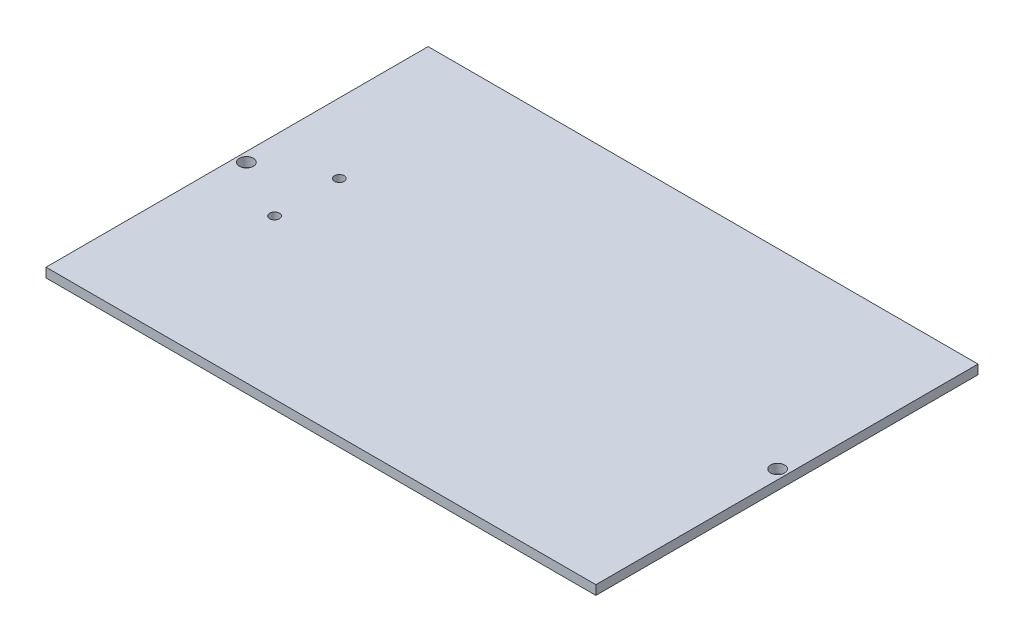
ISO-10303-21;
HEADER;
FILE_DESCRIPTION(('STEP AP214'),'2;1');
FILE_NAME('part.step','',(''),(''),'','','');
FILE_SCHEMA(('AUTOMOTIVE_DESIGN { 1 0 10303 214 1 1 1 1 }'));
ENDSEC;
DATA;
#1=APPLICATION_CONTEXT('core data for automotive mechanical design processes');
#2=APPLICATION_PROTOCOL_DEFINITION('international standard','automotive_design',2000,#1);
#3=PRODUCT_CONTEXT('',#1,'mechanical');
#4=PRODUCT('Part','Part','',(#3));
#5=PRODUCT_RELATED_PRODUCT_CATEGORY('part','',(#4));
#6=PRODUCT_DEFINITION_FORMATION('','',#4);
#7=PRODUCT_DEFINITION_CONTEXT('part definition',#1,'design');
#8=PRODUCT_DEFINITION('design','',#6,#7);
#9=PRODUCT_DEFINITION_SHAPE('','',#8);
#10=(LENGTH_UNIT() NAMED_UNIT(*) SI_UNIT(.MILLI.,.METRE.));
#11=(NAMED_UNIT(*) PLANE_ANGLE_UNIT() SI_UNIT($,.RADIAN.));
#12=(NAMED_UNIT(*) SI_UNIT($,.STERADIAN.) SOLID_ANGLE_UNIT());
#13=UNCERTAINTY_MEASURE_WITH_UNIT(LENGTH_MEASURE(1.E-05),#10,'distance_accuracy_value','');
#14=(GEOMETRIC_REPRESENTATION_CONTEXT(3) GLOBAL_UNCERTAINTY_ASSIGNED_CONTEXT((#13)) GLOBAL_UNIT_ASSIGNED_CONTEXT((#10,
#11,#12)) REPRESENTATION_CONTEXT('',''));
#15=CARTESIAN_POINT('',(0.,0.,0.));
#16=DIRECTION('',(0.,0.,1.));
#17=DIRECTION('',(1.,0.,0.));
#18=AXIS2_PLACEMENT_3D('',#15,#16,#17);
#19=CARTESIAN_POINT('',(59.,2.,41.));
#20=DIRECTION('',(-1.,0.,0.));
#21=DIRECTION('',(0.,0.,1.));
#22=AXIS2_PLACEMENT_3D('',#19,#20,#21);
#23=PLANE('',#22);
#24=DIRECTION('',(0.,0.,-1.));
#25=VECTOR('',#24,1.);
#26=CARTESIAN_POINT('',(59.,0.,41.));
#27=LINE('',#26,#25);
#28=CARTESIAN_POINT('',(59.,0.,41.));
#29=VERTEX_POINT('',#28);
#30=CARTESIAN_POINT('',(59.,0.,-41.));
#31=VERTEX_POINT('',#30);
#32=EDGE_CURVE('E109',#29,#31,#27,.T.);
#33=ORIENTED_EDGE('',*,*,#32,.T.);
#34=DIRECTION('',(0.,-1.,0.));
#35=VECTOR('',#34,1.);
#36=CARTESIAN_POINT('',(59.,2.,-41.));
#37=LINE('',#36,#35);
#38=CARTESIAN_POINT('',(59.,2.,-41.));
#39=VERTEX_POINT('',#38);
#40=EDGE_CURVE('E11',#39,#31,#37,.T.);
#41=ORIENTED_EDGE('',*,*,#40,.F.);
#42=DIRECTION('',(0.,0.,-1.));
#43=VECTOR('',#42,1.);
#44=CARTESIAN_POINT('',(59.,2.,41.));
#45=LINE('',#44,#43);
#46=CARTESIAN_POINT('',(59.,2.,41.));
#47=VERTEX_POINT('',#46);
#48=EDGE_CURVE('E92',#47,#39,#45,.T.);
#49=ORIENTED_EDGE('',*,*,#48,.F.);
#50=DIRECTION('',(0.,-1.,0.));
#51=VECTOR('',#50,1.);
#52=CARTESIAN_POINT('',(59.,2.,41.));
#53=LINE('',#52,#51);
#54=EDGE_CURVE('E105',#47,#29,#53,.T.);
#55=ORIENTED_EDGE('',*,*,#54,.T.);
#56=EDGE_LOOP('',(#33,#41,#49,#55));
#57=FACE_BOUND('',#56,.T.);
#58=ADVANCED_FACE('F38',(#57),#23,.F.);
#59=CARTESIAN_POINT('',(-59.,2.,-41.));
#60=DIRECTION('',(0.,0.,1.));
#61=DIRECTION('',(1.,0.,0.));
#62=AXIS2_PLACEMENT_3D('',#59,#60,#61);
#63=PLANE('',#62);
#64=DIRECTION('',(-1.,0.,0.));
#65=VECTOR('',#64,1.);
#66=CARTESIAN_POINT('',(-59.,0.,-41.));
#67=LINE('',#66,#65);
#68=CARTESIAN_POINT('',(-59.,0.,-41.));
#69=VERTEX_POINT('',#68);
#70=EDGE_CURVE('E97',#31,#69,#67,.T.);
#71=ORIENTED_EDGE('',*,*,#70,.T.);
#72=DIRECTION('',(0.,-1.,0.));
#73=VECTOR('',#72,1.);
#74=CARTESIAN_POINT('',(-59.,2.,-41.));
#75=LINE('',#74,#73);
#76=CARTESIAN_POINT('',(-59.,2.,-41.));
#77=VERTEX_POINT('',#76);
#78=EDGE_CURVE('E48',#77,#69,#75,.T.);
#79=ORIENTED_EDGE('',*,*,#78,.F.);
#80=DIRECTION('',(-1.,0.,0.));
#81=VECTOR('',#80,1.);
#82=CARTESIAN_POINT('',(-59.,2.,-41.));
#83=LINE('',#82,#81);
#84=EDGE_CURVE('E87',#39,#77,#83,.T.);
#85=ORIENTED_EDGE('',*,*,#84,.F.);
#86=ORIENTED_EDGE('',*,*,#40,.T.);
#87=EDGE_LOOP('',(#71,#79,#85,#86));
#88=FACE_BOUND('',#87,.T.);
#89=ADVANCED_FACE('F96',(#88),#63,.F.);
#90=CARTESIAN_POINT('',(-59.,2.,41.));
#91=DIRECTION('',(1.,0.,0.));
#92=DIRECTION('',(0.,0.,-1.));
#93=AXIS2_PLACEMENT_3D('',#90,#91,#92);
#94=PLANE('',#93);
#95=DIRECTION('',(0.,0.,1.));
#96=VECTOR('',#95,1.);
#97=CARTESIAN_POINT('',(-59.,0.,41.));
#98=LINE('',#97,#96);
#99=CARTESIAN_POINT('',(-59.,0.,41.));
#100=VERTEX_POINT('',#99);
#101=EDGE_CURVE('E74',#69,#100,#98,.T.);
#102=ORIENTED_EDGE('',*,*,#101,.T.);
#103=DIRECTION('',(0.,-1.,0.));
#104=VECTOR('',#103,1.);
#105=CARTESIAN_POINT('',(-59.,2.,41.));
#106=LINE('',#105,#104);
#107=CARTESIAN_POINT('',(-59.,2.,41.));
#108=VERTEX_POINT('',#107);
#109=EDGE_CURVE('E99',#108,#100,#106,.T.);
#110=ORIENTED_EDGE('',*,*,#109,.F.);
#111=DIRECTION('',(0.,0.,1.));
#112=VECTOR('',#111,1.);
#113=CARTESIAN_POINT('',(-59.,2.,41.));
#114=LINE('',#113,#112);
#115=EDGE_CURVE('E90',#77,#108,#114,.T.);
#116=ORIENTED_EDGE('',*,*,#115,.F.);
#117=ORIENTED_EDGE('',*,*,#78,.T.);
#118=EDGE_LOOP('',(#102,#110,#116,#117));
#119=FACE_BOUND('',#118,.T.);
#120=ADVANCED_FACE('F101',(#119),#94,.F.);
#121=CARTESIAN_POINT('',(-59.,2.,41.));
#122=DIRECTION('',(0.,0.,-1.));
#123=DIRECTION('',(-1.,0.,0.));
#124=AXIS2_PLACEMENT_3D('',#121,#122,#123);
#125=PLANE('',#124);
#126=DIRECTION('',(1.,0.,0.));
#127=VECTOR('',#126,1.);
#128=CARTESIAN_POINT('',(-59.,0.,41.));
#129=LINE('',#128,#127);
#130=EDGE_CURVE('E80',#100,#29,#129,.T.);
#131=ORIENTED_EDGE('',*,*,#130,.T.);
#132=ORIENTED_EDGE('',*,*,#54,.F.);
#133=DIRECTION('',(1.,0.,0.));
#134=VECTOR('',#133,1.);
#135=CARTESIAN_POINT('',(-59.,2.,41.));
#136=LINE('',#135,#134);
#137=EDGE_CURVE('E57',#108,#47,#136,.T.);
#138=ORIENTED_EDGE('',*,*,#137,.F.);
#139=ORIENTED_EDGE('',*,*,#109,.T.);
#140=EDGE_LOOP('',(#131,#132,#138,#139));
#141=FACE_BOUND('',#140,.T.);
#142=ADVANCED_FACE('F162',(#141),#125,.F.);
#143=CARTESIAN_POINT('',(0.,2.,0.));
#144=DIRECTION('',(0.,-1.,0.));
#145=DIRECTION('',(0.,0.,-1.));
#146=AXIS2_PLACEMENT_3D('',#143,#144,#145);
#147=PLANE('',#146);
#148=CARTESIAN_POINT('',(-57.,2.,0.));
#149=DIRECTION('',(0.,1.,0.));
#150=DIRECTION('',(0.,0.,1.));
#151=AXIS2_PLACEMENT_3D('',#148,#149,#150);
#152=CIRCLE('',#151,1.5);
#153=CARTESIAN_POINT('',(-57.,2.,1.5));
#154=VERTEX_POINT('',#153);
#155=EDGE_CURVE('E126',#154,#154,#152,.T.);
#156=ORIENTED_EDGE('',*,*,#155,.F.);
#157=EDGE_LOOP('',(#156));
#158=FACE_BOUND('',#157,.T.);
#159=CARTESIAN_POINT('',(57.,2.,0.));
#160=DIRECTION('',(0.,1.,0.));
#161=DIRECTION('',(0.,0.,-1.));
#162=AXIS2_PLACEMENT_3D('',#159,#160,#161);
#163=CIRCLE('',#162,1.5);
#164=CARTESIAN_POINT('',(57.,2.,-1.5));
#165=VERTEX_POINT('',#164);
#166=EDGE_CURVE('E134',#165,#165,#163,.T.);
#167=ORIENTED_EDGE('',*,*,#166,.F.);
#168=EDGE_LOOP('',(#167));
#169=FACE_BOUND('',#168,.T.);
#170=CARTESIAN_POINT('',(-44.,2.,-6.95));
#171=DIRECTION('',(0.,1.,0.));
#172=DIRECTION('',(0.,0.,1.));
#173=AXIS2_PLACEMENT_3D('',#170,#171,#172);
#174=CIRCLE('',#173,1.05);
#175=CARTESIAN_POINT('',(-44.,2.,-5.9));
#176=VERTEX_POINT('',#175);
#177=EDGE_CURVE('E145',#176,#176,#174,.T.);
#178=ORIENTED_EDGE('',*,*,#177,.F.);
#179=EDGE_LOOP('',(#178));
#180=FACE_BOUND('',#179,.T.);
#181=CARTESIAN_POINT('',(-44.,2.,6.95));
#182=DIRECTION('',(0.,1.,0.));
#183=DIRECTION('',(0.,0.,1.));
#184=AXIS2_PLACEMENT_3D('',#181,#182,#183);
#185=CIRCLE('',#184,1.05);
#186=CARTESIAN_POINT('',(-44.,2.,8.));
#187=VERTEX_POINT('',#186);
#188=EDGE_CURVE('E132',#187,#187,#185,.T.);
#189=ORIENTED_EDGE('',*,*,#188,.F.);
#190=EDGE_LOOP('',(#189));
#191=FACE_BOUND('',#190,.T.);
#192=ORIENTED_EDGE('',*,*,#48,.T.);
#193=ORIENTED_EDGE('',*,*,#84,.T.);
#194=ORIENTED_EDGE('',*,*,#115,.T.);
#195=ORIENTED_EDGE('',*,*,#137,.T.);
#196=EDGE_LOOP('',(#192,#193,#194,#195));
#197=FACE_BOUND('',#196,.T.);
#198=ADVANCED_FACE('F88',(#158,#169,#180,#191,#197),#147,.F.);
#199=CARTESIAN_POINT('',(0.,0.,0.));
#200=DIRECTION('',(0.,-1.,0.));
#201=DIRECTION('',(0.,0.,-1.));
#202=AXIS2_PLACEMENT_3D('',#199,#200,#201);
#203=PLANE('',#202);
#204=CARTESIAN_POINT('',(-57.,0.,0.));
#205=DIRECTION('',(0.,-1.,0.));
#206=DIRECTION('',(0.,0.,-1.));
#207=AXIS2_PLACEMENT_3D('',#204,#205,#206);
#208=CIRCLE('',#207,1.5);
#209=CARTESIAN_POINT('',(-57.,0.,-1.5));
#210=VERTEX_POINT('',#209);
#211=EDGE_CURVE('E41',#210,#210,#208,.T.);
#212=ORIENTED_EDGE('',*,*,#211,.F.);
#213=EDGE_LOOP('',(#212));
#214=FACE_BOUND('',#213,.T.);
#215=CARTESIAN_POINT('',(57.,0.,0.));
#216=DIRECTION('',(0.,-1.,0.));
#217=DIRECTION('',(0.,0.,-1.));
#218=AXIS2_PLACEMENT_3D('',#215,#216,#217);
#219=CIRCLE('',#218,1.5);
#220=CARTESIAN_POINT('',(57.,0.,-1.5));
#221=VERTEX_POINT('',#220);
#222=EDGE_CURVE('E123',#221,#221,#219,.T.);
#223=ORIENTED_EDGE('',*,*,#222,.F.);
#224=EDGE_LOOP('',(#223));
#225=FACE_BOUND('',#224,.T.);
#226=CARTESIAN_POINT('',(-44.,0.,-6.95));
#227=DIRECTION('',(0.,1.,0.));
#228=DIRECTION('',(0.,0.,1.));
#229=AXIS2_PLACEMENT_3D('',#226,#227,#228);
#230=CIRCLE('',#229,1.05);
#231=CARTESIAN_POINT('',(-44.,0.,-5.9));
#232=VERTEX_POINT('',#231);
#233=EDGE_CURVE('E113',#232,#232,#230,.T.);
#234=ORIENTED_EDGE('',*,*,#233,.T.);
#235=EDGE_LOOP('',(#234));
#236=FACE_BOUND('',#235,.T.);
#237=CARTESIAN_POINT('',(-44.,0.,6.95));
#238=DIRECTION('',(0.,1.,0.));
#239=DIRECTION('',(0.,0.,1.));
#240=AXIS2_PLACEMENT_3D('',#237,#238,#239);
#241=CIRCLE('',#240,1.05);
#242=CARTESIAN_POINT('',(-44.,0.,8.));
#243=VERTEX_POINT('',#242);
#244=EDGE_CURVE('E149',#243,#243,#241,.T.);
#245=ORIENTED_EDGE('',*,*,#244,.T.);
#246=EDGE_LOOP('',(#245));
#247=FACE_BOUND('',#246,.T.);
#248=ORIENTED_EDGE('',*,*,#32,.F.);
#249=ORIENTED_EDGE('',*,*,#130,.F.);
#250=ORIENTED_EDGE('',*,*,#101,.F.);
#251=ORIENTED_EDGE('',*,*,#70,.F.);
#252=EDGE_LOOP('',(#248,#249,#250,#251));
#253=FACE_BOUND('',#252,.T.);
#254=ADVANCED_FACE('F161',(#214,#225,#236,#247,#253),#203,.T.);
#255=CARTESIAN_POINT('',(-44.,0.,6.95));
#256=DIRECTION('',(0.,1.,0.));
#257=DIRECTION('',(0.,0.,1.));
#258=AXIS2_PLACEMENT_3D('',#255,#256,#257);
#259=CYLINDRICAL_SURFACE('',#258,1.05);
#260=ORIENTED_EDGE('',*,*,#244,.F.);
#261=EDGE_LOOP('',(#260));
#262=FACE_BOUND('',#261,.T.);
#263=ORIENTED_EDGE('',*,*,#188,.T.);
#264=EDGE_LOOP('',(#263));
#265=FACE_BOUND('',#264,.T.);
#266=ADVANCED_FACE('F158',(#262,#265),#259,.F.);
#267=CARTESIAN_POINT('',(-44.,0.,-6.95));
#268=DIRECTION('',(0.,1.,0.));
#269=DIRECTION('',(0.,0.,1.));
#270=AXIS2_PLACEMENT_3D('',#267,#268,#269);
#271=CYLINDRICAL_SURFACE('',#270,1.05);
#272=ORIENTED_EDGE('',*,*,#233,.F.);
#273=EDGE_LOOP('',(#272));
#274=FACE_BOUND('',#273,.T.);
#275=ORIENTED_EDGE('',*,*,#177,.T.);
#276=EDGE_LOOP('',(#275));
#277=FACE_BOUND('',#276,.T.);
#278=ADVANCED_FACE('F210',(#274,#277),#271,.F.);
#279=CARTESIAN_POINT('',(57.,-8.,0.));
#280=DIRECTION('',(0.,1.,0.));
#281=DIRECTION('',(0.,0.,1.));
#282=AXIS2_PLACEMENT_3D('',#279,#280,#281);
#283=CYLINDRICAL_SURFACE('',#282,1.5);
#284=ORIENTED_EDGE('',*,*,#222,.T.);
#285=EDGE_LOOP('',(#284));
#286=FACE_BOUND('',#285,.T.);
#287=ORIENTED_EDGE('',*,*,#166,.T.);
#288=EDGE_LOOP('',(#287));
#289=FACE_BOUND('',#288,.T.);
#290=ADVANCED_FACE('F215',(#286,#289),#283,.F.);
#291=CARTESIAN_POINT('',(-57.,-8.,0.));
#292=DIRECTION('',(0.,1.,0.));
#293=DIRECTION('',(0.,0.,1.));
#294=AXIS2_PLACEMENT_3D('',#291,#292,#293);
#295=CYLINDRICAL_SURFACE('',#294,1.5);
#296=ORIENTED_EDGE('',*,*,#211,.T.);
#297=EDGE_LOOP('',(#296));
#298=FACE_BOUND('',#297,.T.);
#299=ORIENTED_EDGE('',*,*,#155,.T.);
#300=EDGE_LOOP('',(#299));
#301=FACE_BOUND('',#300,.T.);
#302=ADVANCED_FACE('F222',(#298,#301),#295,.F.);
#303=CLOSED_SHELL('',(#58,#89,#120,#142,#198,#254,#266,#278,#290,#302));
#304=MANIFOLD_SOLID_BREP('B2',#303);
#305=ADVANCED_BREP_SHAPE_REPRESENTATION('',(#18,#304),#14);
#306=SHAPE_DEFINITION_REPRESENTATION(#9,#305);
ENDSEC;
END-ISO-10303-21;
